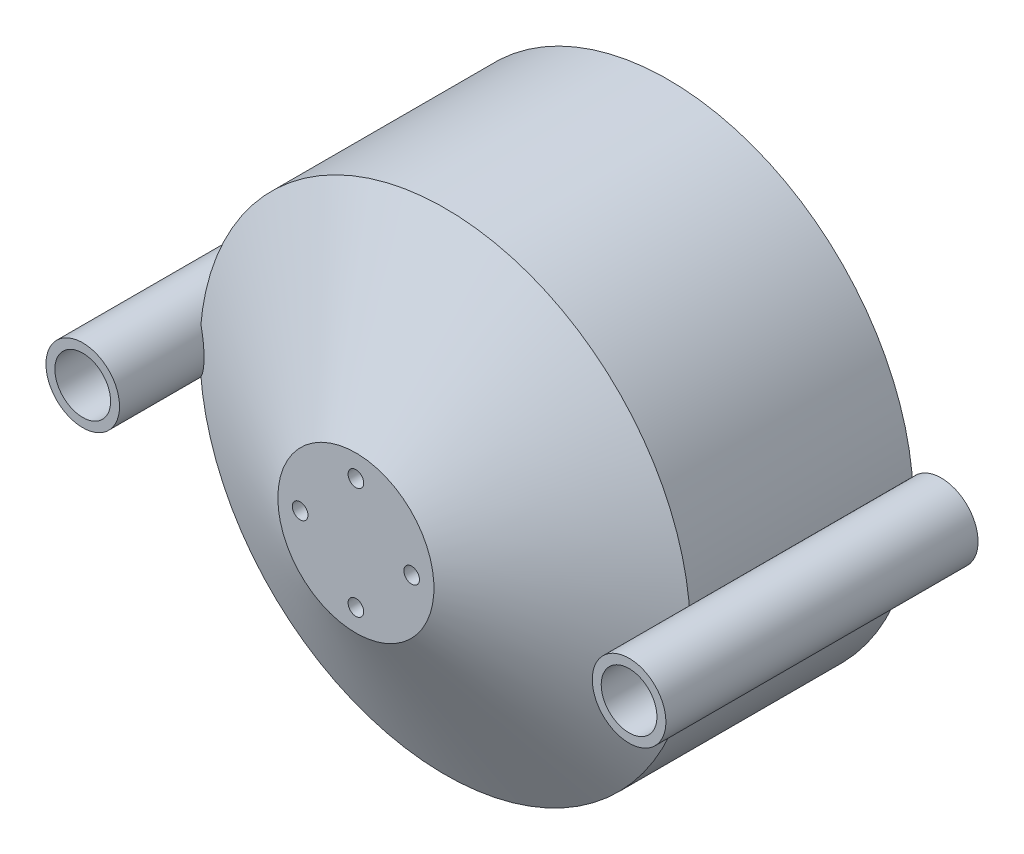
ISO-10303-21;
HEADER;
FILE_DESCRIPTION(('STEP AP214'),'2;1');
FILE_NAME('part.step','',(''),(''),'','','');
FILE_SCHEMA(('AUTOMOTIVE_DESIGN { 1 0 10303 214 1 1 1 1 }'));
ENDSEC;
DATA;
#1=APPLICATION_CONTEXT('core data for automotive mechanical design processes');
#2=APPLICATION_PROTOCOL_DEFINITION('international standard','automotive_design',2000,#1);
#3=PRODUCT_CONTEXT('',#1,'mechanical');
#4=PRODUCT('Part','Part','',(#3));
#5=PRODUCT_RELATED_PRODUCT_CATEGORY('part','',(#4));
#6=PRODUCT_DEFINITION_FORMATION('','',#4);
#7=PRODUCT_DEFINITION_CONTEXT('part definition',#1,'design');
#8=PRODUCT_DEFINITION('design','',#6,#7);
#9=PRODUCT_DEFINITION_SHAPE('','',#8);
#10=(LENGTH_UNIT() NAMED_UNIT(*) SI_UNIT(.MILLI.,.METRE.));
#11=(NAMED_UNIT(*) PLANE_ANGLE_UNIT() SI_UNIT($,.RADIAN.));
#12=(NAMED_UNIT(*) SI_UNIT($,.STERADIAN.) SOLID_ANGLE_UNIT());
#13=UNCERTAINTY_MEASURE_WITH_UNIT(LENGTH_MEASURE(1.E-05),#10,'distance_accuracy_value','');
#14=(GEOMETRIC_REPRESENTATION_CONTEXT(3) GLOBAL_UNCERTAINTY_ASSIGNED_CONTEXT((#13)) GLOBAL_UNIT_ASSIGNED_CONTEXT((#10,
#11,#12)) REPRESENTATION_CONTEXT('',''));
#15=CARTESIAN_POINT('',(0.,0.,0.));
#16=DIRECTION('',(0.,0.,1.));
#17=DIRECTION('',(1.,0.,0.));
#18=AXIS2_PLACEMENT_3D('',#15,#16,#17);
#19=CARTESIAN_POINT('',(61.25,0.,-93.3345237791561));
#20=DIRECTION('',(0.,0.,1.));
#21=DIRECTION('',(1.,0.,0.));
#22=AXIS2_PLACEMENT_3D('',#19,#20,#21);
#23=CYLINDRICAL_SURFACE('',#22,8.25);
#24=CARTESIAN_POINT('',(61.25,0.,0.));
#25=DIRECTION('',(0.,0.,1.));
#26=DIRECTION('',(-1.,0.,0.));
#27=AXIS2_PLACEMENT_3D('',#24,#25,#26);
#28=CIRCLE('',#27,8.25);
#29=CARTESIAN_POINT('',(53.,0.,0.));
#30=VERTEX_POINT('',#29);
#31=EDGE_CURVE('E49',#30,#30,#28,.T.);
#32=ORIENTED_EDGE('',*,*,#31,.F.);
#33=EDGE_LOOP('',(#32));
#34=FACE_BOUND('',#33,.T.);
#35=CARTESIAN_POINT('',(61.25,0.,-70.));
#36=DIRECTION('',(0.,0.,-1.));
#37=DIRECTION('',(-1.,0.,0.));
#38=AXIS2_PLACEMENT_3D('',#35,#36,#37);
#39=CIRCLE('',#38,8.25);
#40=CARTESIAN_POINT('',(53.,0.,-70.));
#41=VERTEX_POINT('',#40);
#42=EDGE_CURVE('E45',#41,#41,#39,.F.);
#43=ORIENTED_EDGE('',*,*,#42,.T.);
#44=EDGE_LOOP('',(#43));
#45=FACE_BOUND('',#44,.T.);
#46=ADVANCED_FACE('F41',(#34,#45),#23,.T.);
#47=CARTESIAN_POINT('',(61.25,0.,-93.3345237791561));
#48=DIRECTION('',(0.,0.,1.));
#49=DIRECTION('',(1.,0.,0.));
#50=AXIS2_PLACEMENT_3D('',#47,#48,#49);
#51=CYLINDRICAL_SURFACE('',#50,6.24999999999999);
#52=CARTESIAN_POINT('',(61.25,0.,0.));
#53=DIRECTION('',(0.,0.,1.));
#54=DIRECTION('',(-1.,0.,0.));
#55=AXIS2_PLACEMENT_3D('',#52,#53,#54);
#56=CIRCLE('',#55,6.24999999999999);
#57=CARTESIAN_POINT('',(55.,0.,0.));
#58=VERTEX_POINT('',#57);
#59=EDGE_CURVE('E53',#58,#58,#56,.T.);
#60=ORIENTED_EDGE('',*,*,#59,.T.);
#61=EDGE_LOOP('',(#60));
#62=FACE_BOUND('',#61,.T.);
#63=CARTESIAN_POINT('',(61.25,0.,-70.));
#64=DIRECTION('',(0.,0.,-1.));
#65=DIRECTION('',(-1.,0.,0.));
#66=AXIS2_PLACEMENT_3D('',#63,#64,#65);
#67=CIRCLE('',#66,6.24999999999999);
#68=CARTESIAN_POINT('',(55.,0.,-70.));
#69=VERTEX_POINT('',#68);
#70=EDGE_CURVE('E11',#69,#69,#67,.F.);
#71=ORIENTED_EDGE('',*,*,#70,.F.);
#72=EDGE_LOOP('',(#71));
#73=FACE_BOUND('',#72,.T.);
#74=ADVANCED_FACE('F68',(#62,#73),#51,.F.);
#75=CARTESIAN_POINT('',(61.25,0.,0.));
#76=DIRECTION('',(0.,0.,-1.));
#77=DIRECTION('',(-1.,0.,0.));
#78=AXIS2_PLACEMENT_3D('',#75,#76,#77);
#79=PLANE('',#78);
#80=ORIENTED_EDGE('',*,*,#59,.F.);
#81=EDGE_LOOP('',(#80));
#82=FACE_BOUND('',#81,.T.);
#83=ORIENTED_EDGE('',*,*,#31,.T.);
#84=EDGE_LOOP('',(#83));
#85=FACE_BOUND('',#84,.T.);
#86=ADVANCED_FACE('F64',(#82,#85),#79,.F.);
#87=CARTESIAN_POINT('',(-55.,0.,-70.));
#88=DIRECTION('',(0.,0.,-1.));
#89=DIRECTION('',(-1.,0.,0.));
#90=AXIS2_PLACEMENT_3D('',#87,#88,#89);
#91=PLANE('',#90);
#92=ORIENTED_EDGE('',*,*,#42,.F.);
#93=EDGE_LOOP('',(#92));
#94=FACE_BOUND('',#93,.T.);
#95=ORIENTED_EDGE('',*,*,#70,.T.);
#96=EDGE_LOOP('',(#95));
#97=FACE_BOUND('',#96,.T.);
#98=ADVANCED_FACE('F43',(#94,#97),#91,.T.);
#99=CLOSED_SHELL('',(#46,#74,#86,#98));
#100=MANIFOLD_SOLID_BREP('B2',#99);
#101=CARTESIAN_POINT('',(-61.25,0.,-93.3345237791561));
#102=DIRECTION('',(0.,0.,1.));
#103=DIRECTION('',(1.,0.,0.));
#104=AXIS2_PLACEMENT_3D('',#101,#102,#103);
#105=CYLINDRICAL_SURFACE('',#104,8.25);
#106=CARTESIAN_POINT('',(-61.25,0.,0.));
#107=DIRECTION('',(0.,0.,1.));
#108=DIRECTION('',(1.,0.,0.));
#109=AXIS2_PLACEMENT_3D('',#106,#107,#108);
#110=CIRCLE('',#109,8.25);
#111=CARTESIAN_POINT('',(-53.,0.,0.));
#112=VERTEX_POINT('',#111);
#113=EDGE_CURVE('E117',#112,#112,#110,.T.);
#114=ORIENTED_EDGE('',*,*,#113,.F.);
#115=EDGE_LOOP('',(#114));
#116=FACE_BOUND('',#115,.T.);
#117=CARTESIAN_POINT('',(-61.25,0.,-70.));
#118=DIRECTION('',(0.,0.,-1.));
#119=DIRECTION('',(-1.,0.,0.));
#120=AXIS2_PLACEMENT_3D('',#117,#118,#119);
#121=CIRCLE('',#120,8.25);
#122=CARTESIAN_POINT('',(-69.5,0.,-70.));
#123=VERTEX_POINT('',#122);
#124=EDGE_CURVE('E113',#123,#123,#121,.F.);
#125=ORIENTED_EDGE('',*,*,#124,.T.);
#126=EDGE_LOOP('',(#125));
#127=FACE_BOUND('',#126,.T.);
#128=ADVANCED_FACE('F109',(#116,#127),#105,.T.);
#129=CARTESIAN_POINT('',(-61.25,0.,-93.3345237791561));
#130=DIRECTION('',(0.,0.,1.));
#131=DIRECTION('',(1.,0.,0.));
#132=AXIS2_PLACEMENT_3D('',#129,#130,#131);
#133=CYLINDRICAL_SURFACE('',#132,6.25);
#134=CARTESIAN_POINT('',(-61.25,0.,0.));
#135=DIRECTION('',(0.,0.,1.));
#136=DIRECTION('',(1.,0.,0.));
#137=AXIS2_PLACEMENT_3D('',#134,#135,#136);
#138=CIRCLE('',#137,6.25);
#139=CARTESIAN_POINT('',(-55.,0.,0.));
#140=VERTEX_POINT('',#139);
#141=EDGE_CURVE('E121',#140,#140,#138,.T.);
#142=ORIENTED_EDGE('',*,*,#141,.T.);
#143=EDGE_LOOP('',(#142));
#144=FACE_BOUND('',#143,.T.);
#145=CARTESIAN_POINT('',(-61.25,0.,-70.));
#146=DIRECTION('',(0.,0.,-1.));
#147=DIRECTION('',(-1.,0.,0.));
#148=AXIS2_PLACEMENT_3D('',#145,#146,#147);
#149=CIRCLE('',#148,6.25);
#150=CARTESIAN_POINT('',(-67.5,0.,-70.));
#151=VERTEX_POINT('',#150);
#152=EDGE_CURVE('E40',#151,#151,#149,.F.);
#153=ORIENTED_EDGE('',*,*,#152,.F.);
#154=EDGE_LOOP('',(#153));
#155=FACE_BOUND('',#154,.T.);
#156=ADVANCED_FACE('F136',(#144,#155),#133,.F.);
#157=CARTESIAN_POINT('',(-61.25,0.,0.));
#158=DIRECTION('',(0.,0.,1.));
#159=DIRECTION('',(1.,0.,0.));
#160=AXIS2_PLACEMENT_3D('',#157,#158,#159);
#161=PLANE('',#160);
#162=ORIENTED_EDGE('',*,*,#141,.F.);
#163=EDGE_LOOP('',(#162));
#164=FACE_BOUND('',#163,.T.);
#165=ORIENTED_EDGE('',*,*,#113,.T.);
#166=EDGE_LOOP('',(#165));
#167=FACE_BOUND('',#166,.T.);
#168=ADVANCED_FACE('F132',(#164,#167),#161,.T.);
#169=CARTESIAN_POINT('',(-55.,0.,-70.));
#170=DIRECTION('',(0.,0.,-1.));
#171=DIRECTION('',(-1.,0.,0.));
#172=AXIS2_PLACEMENT_3D('',#169,#170,#171);
#173=PLANE('',#172);
#174=ORIENTED_EDGE('',*,*,#124,.F.);
#175=EDGE_LOOP('',(#174));
#176=FACE_BOUND('',#175,.T.);
#177=ORIENTED_EDGE('',*,*,#152,.T.);
#178=EDGE_LOOP('',(#177));
#179=FACE_BOUND('',#178,.T.);
#180=ADVANCED_FACE('F111',(#176,#179),#173,.T.);
#181=CLOSED_SHELL('',(#128,#156,#168,#180));
#182=MANIFOLD_SOLID_BREP('B6',#181);
#183=CARTESIAN_POINT('',(0.,0.,0.));
#184=DIRECTION('',(0.,0.,1.));
#185=DIRECTION('',(1.,0.,0.));
#186=AXIS2_PLACEMENT_3D('',#183,#184,#185);
#187=PLANE('',#186);
#188=CARTESIAN_POINT('',(0.,12.5,0.));
#189=DIRECTION('',(0.,0.,1.));
#190=DIRECTION('',(1.,0.,0.));
#191=AXIS2_PLACEMENT_3D('',#188,#189,#190);
#192=CIRCLE('',#191,1.75);
#193=CARTESIAN_POINT('',(1.75,12.5,0.));
#194=VERTEX_POINT('',#193);
#195=EDGE_CURVE('E190',#194,#194,#192,.T.);
#196=ORIENTED_EDGE('',*,*,#195,.F.);
#197=EDGE_LOOP('',(#196));
#198=FACE_BOUND('',#197,.T.);
#199=CARTESIAN_POINT('',(12.5000000000004,3.53740559381116E-13,0.));
#200=DIRECTION('',(0.,0.,1.));
#201=DIRECTION('',(1.,0.,0.));
#202=AXIS2_PLACEMENT_3D('',#199,#200,#201);
#203=CIRCLE('',#202,1.75000000000028);
#204=CARTESIAN_POINT('',(14.2500000000006,3.53740559381116E-13,0.));
#205=VERTEX_POINT('',#204);
#206=EDGE_CURVE('E240',#205,#205,#203,.T.);
#207=ORIENTED_EDGE('',*,*,#206,.F.);
#208=EDGE_LOOP('',(#207));
#209=FACE_BOUND('',#208,.T.);
#210=CARTESIAN_POINT('',(7.08093442161805E-13,-12.5,0.));
#211=DIRECTION('',(0.,0.,1.));
#212=DIRECTION('',(1.,0.,0.));
#213=AXIS2_PLACEMENT_3D('',#210,#211,#212);
#214=CIRCLE('',#213,1.75000000000076);
#215=CARTESIAN_POINT('',(1.75000000000147,-12.5,0.));
#216=VERTEX_POINT('',#215);
#217=EDGE_CURVE('E244',#216,#216,#214,.T.);
#218=ORIENTED_EDGE('',*,*,#217,.F.);
#219=EDGE_LOOP('',(#218));
#220=FACE_BOUND('',#219,.T.);
#221=CARTESIAN_POINT('',(-12.4999999999996,-3.5527136788005E-13,0.));
#222=DIRECTION('',(0.,0.,1.));
#223=DIRECTION('',(1.,0.,0.));
#224=AXIS2_PLACEMENT_3D('',#221,#222,#223);
#225=CIRCLE('',#224,1.75000000000057);
#226=CARTESIAN_POINT('',(-10.7499999999991,-3.5527136788005E-13,0.));
#227=VERTEX_POINT('',#226);
#228=EDGE_CURVE('E209',#227,#227,#225,.T.);
#229=ORIENTED_EDGE('',*,*,#228,.F.);
#230=EDGE_LOOP('',(#229));
#231=FACE_BOUND('',#230,.T.);
#232=CARTESIAN_POINT('',(0.,0.,0.));
#233=DIRECTION('',(0.,0.,-1.));
#234=DIRECTION('',(-1.,0.,0.));
#235=AXIS2_PLACEMENT_3D('',#232,#233,#234);
#236=CIRCLE('',#235,17.5);
#237=CARTESIAN_POINT('',(-17.5,0.,0.));
#238=VERTEX_POINT('',#237);
#239=EDGE_CURVE('E108',#238,#238,#236,.T.);
#240=ORIENTED_EDGE('',*,*,#239,.F.);
#241=EDGE_LOOP('',(#240));
#242=FACE_BOUND('',#241,.T.);
#243=ADVANCED_FACE('F170',(#198,#209,#220,#231,#242),#187,.T.);
#244=CARTESIAN_POINT('',(0.,0.,-20.));
#245=DIRECTION('',(0.,0.,-1.));
#246=DIRECTION('',(-1.,0.,0.));
#247=AXIS2_PLACEMENT_3D('',#244,#245,#246);
#248=CONICAL_SURFACE('',#247,55.,1.08083900054117);
#249=CARTESIAN_POINT('',(0.,0.,-20.));
#250=DIRECTION('',(0.,0.,-1.));
#251=DIRECTION('',(-1.,0.,0.));
#252=AXIS2_PLACEMENT_3D('',#249,#250,#251);
#253=CIRCLE('',#252,55.);
#254=CARTESIAN_POINT('',(-55.,0.,-20.));
#255=VERTEX_POINT('',#254);
#256=EDGE_CURVE('E177',#255,#255,#253,.T.);
#257=CARTESIAN_POINT('',(-17.5,0.,0.));
#258=CARTESIAN_POINT('',(-17.890625,0.,-0.208333333333335));
#259=CARTESIAN_POINT('',(-18.28125,0.,-0.416666666666668));
#260=CARTESIAN_POINT('',(-19.0625,0.,-0.833333333333334));
#261=CARTESIAN_POINT('',(-19.453125,0.,-1.04166666666667));
#262=CARTESIAN_POINT('',(-20.234375,0.,-1.45833333333333));
#263=CARTESIAN_POINT('',(-20.625,0.,-1.66666666666667));
#264=CARTESIAN_POINT('',(-21.40625,0.,-2.08333333333333));
#265=CARTESIAN_POINT('',(-21.796875,0.,-2.29166666666666));
#266=CARTESIAN_POINT('',(-22.578125,0.,-2.70833333333333));
#267=CARTESIAN_POINT('',(-22.96875,0.,-2.91666666666667));
#268=CARTESIAN_POINT('',(-23.75,0.,-3.33333333333333));
#269=CARTESIAN_POINT('',(-24.140625,0.,-3.54166666666667));
#270=CARTESIAN_POINT('',(-24.921875,0.,-3.95833333333333));
#271=CARTESIAN_POINT('',(-25.3125,0.,-4.16666666666667));
#272=CARTESIAN_POINT('',(-26.09375,0.,-4.58333333333333));
#273=CARTESIAN_POINT('',(-26.484375,0.,-4.79166666666666));
#274=CARTESIAN_POINT('',(-27.265625,0.,-5.20833333333333));
#275=CARTESIAN_POINT('',(-27.65625,0.,-5.41666666666666));
#276=CARTESIAN_POINT('',(-28.4375,0.,-5.83333333333333));
#277=CARTESIAN_POINT('',(-28.828125,0.,-6.04166666666667));
#278=CARTESIAN_POINT('',(-29.609375,0.,-6.45833333333333));
#279=CARTESIAN_POINT('',(-30.,0.,-6.66666666666666));
#280=CARTESIAN_POINT('',(-30.78125,0.,-7.08333333333333));
#281=CARTESIAN_POINT('',(-31.171875,0.,-7.29166666666667));
#282=CARTESIAN_POINT('',(-31.953125,0.,-7.70833333333333));
#283=CARTESIAN_POINT('',(-32.34375,0.,-7.91666666666666));
#284=CARTESIAN_POINT('',(-33.125,0.,-8.33333333333333));
#285=CARTESIAN_POINT('',(-33.515625,0.,-8.54166666666666));
#286=CARTESIAN_POINT('',(-34.296875,0.,-8.95833333333333));
#287=CARTESIAN_POINT('',(-34.6875,0.,-9.16666666666666));
#288=CARTESIAN_POINT('',(-35.46875,0.,-9.58333333333333));
#289=CARTESIAN_POINT('',(-35.859375,0.,-9.79166666666666));
#290=CARTESIAN_POINT('',(-36.640625,0.,-10.2083333333333));
#291=CARTESIAN_POINT('',(-37.03125,0.,-10.4166666666667));
#292=CARTESIAN_POINT('',(-37.8125,0.,-10.8333333333333));
#293=CARTESIAN_POINT('',(-38.203125,0.,-11.0416666666667));
#294=CARTESIAN_POINT('',(-38.984375,0.,-11.4583333333333));
#295=CARTESIAN_POINT('',(-39.375,0.,-11.6666666666667));
#296=CARTESIAN_POINT('',(-40.15625,0.,-12.0833333333333));
#297=CARTESIAN_POINT('',(-40.546875,0.,-12.2916666666667));
#298=CARTESIAN_POINT('',(-41.328125,0.,-12.7083333333333));
#299=CARTESIAN_POINT('',(-41.71875,0.,-12.9166666666667));
#300=CARTESIAN_POINT('',(-42.5,0.,-13.3333333333333));
#301=CARTESIAN_POINT('',(-42.890625,0.,-13.5416666666667));
#302=CARTESIAN_POINT('',(-43.671875,0.,-13.9583333333333));
#303=CARTESIAN_POINT('',(-44.0625,0.,-14.1666666666667));
#304=CARTESIAN_POINT('',(-44.84375,0.,-14.5833333333333));
#305=CARTESIAN_POINT('',(-45.234375,0.,-14.7916666666667));
#306=CARTESIAN_POINT('',(-46.015625,0.,-15.2083333333333));
#307=CARTESIAN_POINT('',(-46.40625,0.,-15.4166666666667));
#308=CARTESIAN_POINT('',(-47.1875,0.,-15.8333333333333));
#309=CARTESIAN_POINT('',(-47.578125,0.,-16.0416666666667));
#310=CARTESIAN_POINT('',(-48.359375,0.,-16.4583333333333));
#311=CARTESIAN_POINT('',(-48.75,0.,-16.6666666666667));
#312=CARTESIAN_POINT('',(-49.53125,0.,-17.0833333333333));
#313=CARTESIAN_POINT('',(-49.921875,0.,-17.2916666666667));
#314=CARTESIAN_POINT('',(-50.703125,0.,-17.7083333333333));
#315=CARTESIAN_POINT('',(-51.09375,0.,-17.9166666666667));
#316=CARTESIAN_POINT('',(-51.875,0.,-18.3333333333333));
#317=CARTESIAN_POINT('',(-52.265625,0.,-18.5416666666667));
#318=CARTESIAN_POINT('',(-53.046875,0.,-18.9583333333333));
#319=CARTESIAN_POINT('',(-53.4375,0.,-19.1666666666667));
#320=CARTESIAN_POINT('',(-54.21875,0.,-19.5833333333333));
#321=CARTESIAN_POINT('',(-54.609375,0.,-19.7916666666667));
#322=CARTESIAN_POINT('',(-55.,0.,-20.));
#323=B_SPLINE_CURVE_WITH_KNOTS('',3,(#257,#258,#259,#260,#261,#262,#263,#264,#265,#266,#267,
#268,#269,#270,#271,#272,#273,#274,#275,#276,#277,#278,#279,#280,#281,#282,#283,#284,#285,#286,
#287,#288,#289,#290,#291,#292,#293,#294,#295,#296,#297,#298,#299,#300,#301,#302,#303,#304,#305,
#306,#307,#308,#309,#310,#311,#312,#313,#314,#315,#316,#317,#318,#319,#320,#321,#322),
.UNSPECIFIED.,.F.,.F.,(4,2,2,2,2,2,2,2,2,2,2,2,2,2,2,2,2,2,2,2,2,2,2,2,2,2,2,2,2,2,2,2,4),(0.,
1.328125,2.65625,3.98437499999999,5.3125,6.64062499999999,7.96875,9.296875,10.625,11.953125,
13.28125,14.609375,15.9375,17.265625,18.59375,19.921875,21.25,22.578125,23.90625,25.234375,
26.5625,27.890625,29.21875,30.546875,31.875,33.203125,34.53125,35.859375,37.1875,38.515625,
39.84375,41.171875,42.5),.UNSPECIFIED.);
#324=EDGE_CURVE('BSEAM221',#238,#255,#323,.T.);
#325=ORIENTED_EDGE('',*,*,#239,.T.);
#326=ORIENTED_EDGE('',*,*,#256,.F.);
#327=ORIENTED_EDGE('',*,*,#324,.T.);
#328=ORIENTED_EDGE('',*,*,#324,.F.);
#329=EDGE_LOOP('',(#325,#327,#326,#328));
#330=FACE_BOUND('',#329,.T.);
#331=ADVANCED_FACE('F221',(#330),#248,.T.);
#332=CARTESIAN_POINT('',(0.,0.,-52.2554347826087));
#333=DIRECTION('',(0.,0.,-1.));
#334=DIRECTION('',(-1.,0.,0.));
#335=AXIS2_PLACEMENT_3D('',#332,#333,#334);
#336=CYLINDRICAL_SURFACE('',#335,55.);
#337=ORIENTED_EDGE('',*,*,#256,.T.);
#338=EDGE_LOOP('',(#337));
#339=FACE_BOUND('',#338,.T.);
#340=CARTESIAN_POINT('',(0.,0.,-70.));
#341=DIRECTION('',(0.,0.,-1.));
#342=DIRECTION('',(-1.,0.,0.));
#343=AXIS2_PLACEMENT_3D('',#340,#341,#342);
#344=CIRCLE('',#343,55.);
#345=CARTESIAN_POINT('',(-55.,0.,-70.));
#346=VERTEX_POINT('',#345);
#347=EDGE_CURVE('E182',#346,#346,#344,.T.);
#348=ORIENTED_EDGE('',*,*,#347,.F.);
#349=EDGE_LOOP('',(#348));
#350=FACE_BOUND('',#349,.T.);
#351=ADVANCED_FACE('F219',(#339,#350),#336,.T.);
#352=CARTESIAN_POINT('',(-55.,0.,-70.));
#353=DIRECTION('',(0.,0.,-1.));
#354=DIRECTION('',(-1.,0.,0.));
#355=AXIS2_PLACEMENT_3D('',#352,#353,#354);
#356=PLANE('',#355);
#357=ORIENTED_EDGE('',*,*,#347,.T.);
#358=EDGE_LOOP('',(#357));
#359=FACE_BOUND('',#358,.T.);
#360=CARTESIAN_POINT('',(0.,0.,-70.));
#361=DIRECTION('',(0.,0.,-1.));
#362=DIRECTION('',(-1.,0.,0.));
#363=AXIS2_PLACEMENT_3D('',#360,#361,#362);
#364=CIRCLE('',#363,52.5);
#365=CARTESIAN_POINT('',(-52.5,0.,-70.));
#366=VERTEX_POINT('',#365);
#367=EDGE_CURVE('E206',#366,#366,#364,.T.);
#368=ORIENTED_EDGE('',*,*,#367,.F.);
#369=EDGE_LOOP('',(#368));
#370=FACE_BOUND('',#369,.T.);
#371=ADVANCED_FACE('F216',(#359,#370),#356,.T.);
#372=CARTESIAN_POINT('',(0.,0.,-52.2554347826087));
#373=DIRECTION('',(0.,0.,-1.));
#374=DIRECTION('',(-1.,0.,0.));
#375=AXIS2_PLACEMENT_3D('',#372,#373,#374);
#376=CYLINDRICAL_SURFACE('',#375,52.5);
#377=ORIENTED_EDGE('',*,*,#367,.T.);
#378=EDGE_LOOP('',(#377));
#379=FACE_BOUND('',#378,.T.);
#380=CARTESIAN_POINT('',(0.,0.,-21.5));
#381=DIRECTION('',(0.,0.,-1.));
#382=DIRECTION('',(-1.,0.,0.));
#383=AXIS2_PLACEMENT_3D('',#380,#381,#382);
#384=CIRCLE('',#383,52.5);
#385=CARTESIAN_POINT('',(-52.5,0.,-21.5));
#386=VERTEX_POINT('',#385);
#387=EDGE_CURVE('E201',#386,#386,#384,.T.);
#388=ORIENTED_EDGE('',*,*,#387,.F.);
#389=EDGE_LOOP('',(#388));
#390=FACE_BOUND('',#389,.T.);
#391=ADVANCED_FACE('F228',(#379,#390),#376,.F.);
#392=CARTESIAN_POINT('',(0.,0.,-6.));
#393=DIRECTION('',(0.,0.,-1.));
#394=DIRECTION('',(-1.,0.,0.));
#395=AXIS2_PLACEMENT_3D('',#392,#393,#394);
#396=CONICAL_SURFACE('',#395,23.4375,1.08083900054117);
#397=ORIENTED_EDGE('',*,*,#387,.T.);
#398=EDGE_LOOP('',(#397));
#399=FACE_BOUND('',#398,.T.);
#400=CARTESIAN_POINT('',(0.,0.,-6.));
#401=DIRECTION('',(0.,0.,-1.));
#402=DIRECTION('',(-1.,0.,0.));
#403=AXIS2_PLACEMENT_3D('',#400,#401,#402);
#404=CIRCLE('',#403,23.4375);
#405=CARTESIAN_POINT('',(-23.4375,0.,-6.));
#406=VERTEX_POINT('',#405);
#407=EDGE_CURVE('E197',#406,#406,#404,.T.);
#408=ORIENTED_EDGE('',*,*,#407,.F.);
#409=EDGE_LOOP('',(#408));
#410=FACE_BOUND('',#409,.T.);
#411=ADVANCED_FACE('F273',(#399,#410),#396,.F.);
#412=CARTESIAN_POINT('',(0.,0.,-6.));
#413=DIRECTION('',(0.,0.,-1.));
#414=DIRECTION('',(-1.,0.,0.));
#415=AXIS2_PLACEMENT_3D('',#412,#413,#414);
#416=PLANE('',#415);
#417=CARTESIAN_POINT('',(0.,12.5,-6.00000000000001));
#418=DIRECTION('',(0.,0.,-1.));
#419=DIRECTION('',(-1.,0.,0.));
#420=AXIS2_PLACEMENT_3D('',#417,#418,#419);
#421=CIRCLE('',#420,1.75);
#422=CARTESIAN_POINT('',(-1.75,12.5,-6.00000000000001));
#423=VERTEX_POINT('',#422);
#424=EDGE_CURVE('E173',#423,#423,#421,.T.);
#425=ORIENTED_EDGE('',*,*,#424,.F.);
#426=EDGE_LOOP('',(#425));
#427=FACE_BOUND('',#426,.T.);
#428=CARTESIAN_POINT('',(12.5000000000004,3.53740559381116E-13,-6.00000000000001));
#429=DIRECTION('',(0.,0.,-1.));
#430=DIRECTION('',(-1.,0.,0.));
#431=AXIS2_PLACEMENT_3D('',#428,#429,#430);
#432=CIRCLE('',#431,1.75000000000028);
#433=CARTESIAN_POINT('',(10.7500000000001,3.53740559381116E-13,-6.00000000000001));
#434=VERTEX_POINT('',#433);
#435=EDGE_CURVE('E192',#434,#434,#432,.T.);
#436=ORIENTED_EDGE('',*,*,#435,.F.);
#437=EDGE_LOOP('',(#436));
#438=FACE_BOUND('',#437,.T.);
#439=CARTESIAN_POINT('',(7.08093442161805E-13,-12.5,-6.00000000000001));
#440=DIRECTION('',(0.,0.,-1.));
#441=DIRECTION('',(-1.,0.,0.));
#442=AXIS2_PLACEMENT_3D('',#439,#440,#441);
#443=CIRCLE('',#442,1.75000000000076);
#444=CARTESIAN_POINT('',(-1.75000000000005,-12.5,-6.00000000000001));
#445=VERTEX_POINT('',#444);
#446=EDGE_CURVE('E189',#445,#445,#443,.T.);
#447=ORIENTED_EDGE('',*,*,#446,.F.);
#448=EDGE_LOOP('',(#447));
#449=FACE_BOUND('',#448,.T.);
#450=CARTESIAN_POINT('',(-12.4999999999996,-3.5527136788005E-13,-6.00000000000001));
#451=DIRECTION('',(0.,0.,-1.));
#452=DIRECTION('',(-1.,0.,0.));
#453=AXIS2_PLACEMENT_3D('',#450,#451,#452);
#454=CIRCLE('',#453,1.75000000000057);
#455=CARTESIAN_POINT('',(-14.2500000000002,-3.5527136788005E-13,-6.00000000000001));
#456=VERTEX_POINT('',#455);
#457=EDGE_CURVE('E186',#456,#456,#454,.T.);
#458=ORIENTED_EDGE('',*,*,#457,.F.);
#459=EDGE_LOOP('',(#458));
#460=FACE_BOUND('',#459,.T.);
#461=ORIENTED_EDGE('',*,*,#407,.T.);
#462=EDGE_LOOP('',(#461));
#463=FACE_BOUND('',#462,.T.);
#464=ADVANCED_FACE('F269',(#427,#438,#449,#460,#463),#416,.T.);
#465=CARTESIAN_POINT('',(-12.4999999999996,-3.5527136788005E-13,-70.));
#466=DIRECTION('',(0.,0.,1.));
#467=DIRECTION('',(1.,0.,0.));
#468=AXIS2_PLACEMENT_3D('',#465,#466,#467);
#469=CYLINDRICAL_SURFACE('',#468,1.75000000000057);
#470=ORIENTED_EDGE('',*,*,#457,.T.);
#471=EDGE_LOOP('',(#470));
#472=FACE_BOUND('',#471,.T.);
#473=ORIENTED_EDGE('',*,*,#228,.T.);
#474=EDGE_LOOP('',(#473));
#475=FACE_BOUND('',#474,.T.);
#476=ADVANCED_FACE('F265',(#472,#475),#469,.F.);
#477=CARTESIAN_POINT('',(7.08093442161805E-13,-12.5,-70.));
#478=DIRECTION('',(0.,0.,1.));
#479=DIRECTION('',(1.,0.,0.));
#480=AXIS2_PLACEMENT_3D('',#477,#478,#479);
#481=CYLINDRICAL_SURFACE('',#480,1.75000000000076);
#482=ORIENTED_EDGE('',*,*,#446,.T.);
#483=EDGE_LOOP('',(#482));
#484=FACE_BOUND('',#483,.T.);
#485=ORIENTED_EDGE('',*,*,#217,.T.);
#486=EDGE_LOOP('',(#485));
#487=FACE_BOUND('',#486,.T.);
#488=ADVANCED_FACE('F260',(#484,#487),#481,.F.);
#489=CARTESIAN_POINT('',(12.5000000000004,3.53740559381116E-13,-70.));
#490=DIRECTION('',(0.,0.,1.));
#491=DIRECTION('',(1.,0.,0.));
#492=AXIS2_PLACEMENT_3D('',#489,#490,#491);
#493=CYLINDRICAL_SURFACE('',#492,1.75000000000028);
#494=ORIENTED_EDGE('',*,*,#435,.T.);
#495=EDGE_LOOP('',(#494));
#496=FACE_BOUND('',#495,.T.);
#497=ORIENTED_EDGE('',*,*,#206,.T.);
#498=EDGE_LOOP('',(#497));
#499=FACE_BOUND('',#498,.T.);
#500=ADVANCED_FACE('F255',(#496,#499),#493,.F.);
#501=CARTESIAN_POINT('',(0.,12.5,-70.));
#502=DIRECTION('',(0.,0.,1.));
#503=DIRECTION('',(1.,0.,0.));
#504=AXIS2_PLACEMENT_3D('',#501,#502,#503);
#505=CYLINDRICAL_SURFACE('',#504,1.75);
#506=ORIENTED_EDGE('',*,*,#424,.T.);
#507=EDGE_LOOP('',(#506));
#508=FACE_BOUND('',#507,.T.);
#509=ORIENTED_EDGE('',*,*,#195,.T.);
#510=EDGE_LOOP('',(#509));
#511=FACE_BOUND('',#510,.T.);
#512=ADVANCED_FACE('F253',(#508,#511),#505,.F.);
#513=CLOSED_SHELL('',(#243,#331,#351,#371,#391,#411,#464,#476,#488,#500,#512));
#514=MANIFOLD_SOLID_BREP('B35',#513);
#515=ADVANCED_BREP_SHAPE_REPRESENTATION('',(#18,#100,#182,#514),#14);
#516=SHAPE_DEFINITION_REPRESENTATION(#9,#515);
ENDSEC;
END-ISO-10303-21;
